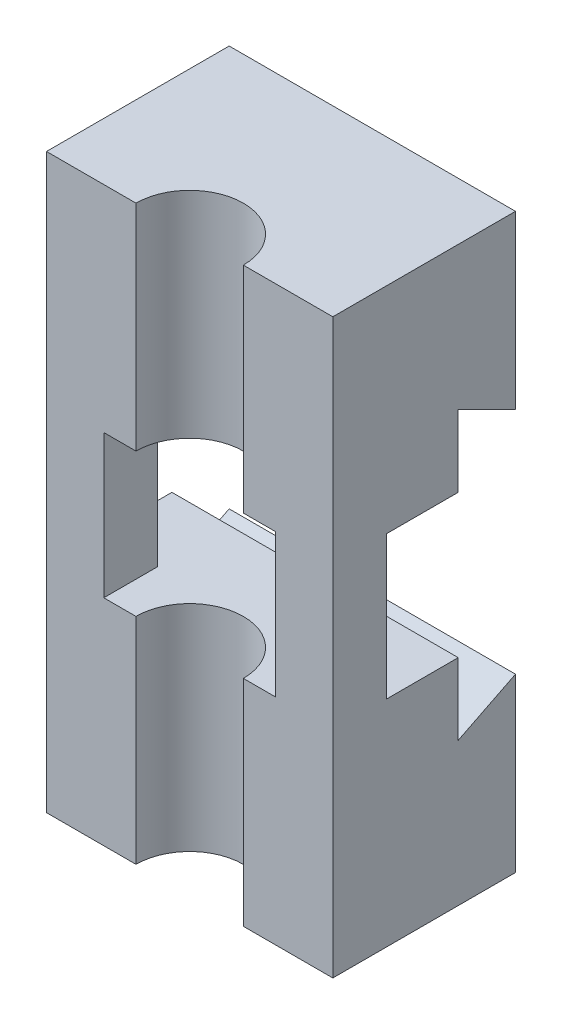
ISO-10303-21;
HEADER;
FILE_DESCRIPTION(('STEP AP214'),'2;1');
FILE_NAME('part.step','',(''),(''),'','','');
FILE_SCHEMA(('AUTOMOTIVE_DESIGN { 1 0 10303 214 1 1 1 1 }'));
ENDSEC;
DATA;
#1=APPLICATION_CONTEXT('core data for automotive mechanical design processes');
#2=APPLICATION_PROTOCOL_DEFINITION('international standard','automotive_design',2000,#1);
#3=PRODUCT_CONTEXT('',#1,'mechanical');
#4=PRODUCT('Part','Part','',(#3));
#5=PRODUCT_RELATED_PRODUCT_CATEGORY('part','',(#4));
#6=PRODUCT_DEFINITION_FORMATION('','',#4);
#7=PRODUCT_DEFINITION_CONTEXT('part definition',#1,'design');
#8=PRODUCT_DEFINITION('design','',#6,#7);
#9=PRODUCT_DEFINITION_SHAPE('','',#8);
#10=(LENGTH_UNIT() NAMED_UNIT(*) SI_UNIT(.MILLI.,.METRE.));
#11=(NAMED_UNIT(*) PLANE_ANGLE_UNIT() SI_UNIT($,.RADIAN.));
#12=(NAMED_UNIT(*) SI_UNIT($,.STERADIAN.) SOLID_ANGLE_UNIT());
#13=UNCERTAINTY_MEASURE_WITH_UNIT(LENGTH_MEASURE(1.E-05),#10,'distance_accuracy_value','');
#14=(GEOMETRIC_REPRESENTATION_CONTEXT(3) GLOBAL_UNCERTAINTY_ASSIGNED_CONTEXT((#13)) GLOBAL_UNIT_ASSIGNED_CONTEXT((#10,
#11,#12)) REPRESENTATION_CONTEXT('',''));
#15=CARTESIAN_POINT('',(0.,0.,0.));
#16=DIRECTION('',(0.,0.,1.));
#17=DIRECTION('',(1.,0.,0.));
#18=AXIS2_PLACEMENT_3D('',#15,#16,#17);
#19=CARTESIAN_POINT('',(10.,2.5,0.));
#20=DIRECTION('',(0.,1.,0.));
#21=DIRECTION('',(0.,0.,1.));
#22=AXIS2_PLACEMENT_3D('',#19,#20,#21);
#23=PLANE('',#22);
#24=DIRECTION('',(1.,0.,0.));
#25=VECTOR('',#24,1.);
#26=CARTESIAN_POINT('',(10.,2.5,-1.12));
#27=LINE('',#26,#25);
#28=CARTESIAN_POINT('',(2.,2.5,-1.12));
#29=VERTEX_POINT('',#28);
#30=CARTESIAN_POINT('',(3.125,2.5,-1.12));
#31=VERTEX_POINT('',#30);
#32=EDGE_CURVE('E60',#29,#31,#27,.T.);
#33=ORIENTED_EDGE('',*,*,#32,.F.);
#34=DIRECTION('',(0.,0.,-1.));
#35=VECTOR('',#34,1.);
#36=CARTESIAN_POINT('',(2.,2.5,1.88));
#37=LINE('',#36,#35);
#38=CARTESIAN_POINT('',(2.,2.5,-3.));
#39=VERTEX_POINT('',#38);
#40=EDGE_CURVE('E308',#29,#39,#37,.T.);
#41=ORIENTED_EDGE('',*,*,#40,.T.);
#42=DIRECTION('',(-1.,0.,0.));
#43=VECTOR('',#42,1.);
#44=CARTESIAN_POINT('',(10.,2.5,-3.));
#45=LINE('',#44,#43);
#46=CARTESIAN_POINT('',(0.,2.5,-3.));
#47=VERTEX_POINT('',#46);
#48=EDGE_CURVE('E261',#39,#47,#45,.T.);
#49=ORIENTED_EDGE('',*,*,#48,.T.);
#50=DIRECTION('',(0.,0.,-1.));
#51=VECTOR('',#50,1.);
#52=CARTESIAN_POINT('',(0.,2.5,0.));
#53=LINE('',#52,#51);
#54=CARTESIAN_POINT('',(0.,2.5,-5.5));
#55=VERTEX_POINT('',#54);
#56=EDGE_CURVE('E348',#47,#55,#53,.T.);
#57=ORIENTED_EDGE('',*,*,#56,.T.);
#58=DIRECTION('',(-1.,0.,0.));
#59=VECTOR('',#58,1.);
#60=CARTESIAN_POINT('',(10.,2.5,-5.5));
#61=LINE('',#60,#59);
#62=CARTESIAN_POINT('',(10.,2.5,-5.5));
#63=VERTEX_POINT('',#62);
#64=EDGE_CURVE('E257',#63,#55,#61,.T.);
#65=ORIENTED_EDGE('',*,*,#64,.F.);
#66=DIRECTION('',(0.,0.,-1.));
#67=VECTOR('',#66,1.);
#68=CARTESIAN_POINT('',(10.,2.5,0.));
#69=LINE('',#68,#67);
#70=CARTESIAN_POINT('',(10.,2.5,-3.));
#71=VERTEX_POINT('',#70);
#72=EDGE_CURVE('E316',#71,#63,#69,.T.);
#73=ORIENTED_EDGE('',*,*,#72,.F.);
#74=CARTESIAN_POINT('',(8.,2.5,-3.));
#75=VERTEX_POINT('',#74);
#76=EDGE_CURVE('E262',#71,#75,#45,.T.);
#77=ORIENTED_EDGE('',*,*,#76,.T.);
#78=DIRECTION('',(0.,0.,-1.));
#79=VECTOR('',#78,1.);
#80=CARTESIAN_POINT('',(8.,2.5,1.88));
#81=LINE('',#80,#79);
#82=CARTESIAN_POINT('',(8.,2.5,-1.12));
#83=VERTEX_POINT('',#82);
#84=EDGE_CURVE('E283',#83,#75,#81,.T.);
#85=ORIENTED_EDGE('',*,*,#84,.F.);
#86=CARTESIAN_POINT('',(6.875,2.5,-1.12));
#87=VERTEX_POINT('',#86);
#88=EDGE_CURVE('E274',#87,#83,#27,.T.);
#89=ORIENTED_EDGE('',*,*,#88,.F.);
#90=CARTESIAN_POINT('',(5.,2.5,-1.12));
#91=DIRECTION('',(0.,1.,0.));
#92=DIRECTION('',(0.,0.,1.));
#93=AXIS2_PLACEMENT_3D('',#90,#91,#92);
#94=CIRCLE('',#93,1.875);
#95=EDGE_CURVE('E269',#87,#31,#94,.T.);
#96=ORIENTED_EDGE('',*,*,#95,.T.);
#97=EDGE_LOOP('',(#33,#41,#49,#57,#65,#73,#77,#85,#89,#96));
#98=FACE_BOUND('',#97,.T.);
#99=ADVANCED_FACE('F45',(#98),#23,.F.);
#100=CARTESIAN_POINT('',(10.,9.99999999999999,0.));
#101=DIRECTION('',(0.,-1.,0.));
#102=DIRECTION('',(0.,0.,-1.));
#103=AXIS2_PLACEMENT_3D('',#100,#101,#102);
#104=PLANE('',#103);
#105=DIRECTION('',(-1.,0.,0.));
#106=VECTOR('',#105,1.);
#107=CARTESIAN_POINT('',(10.,9.99999999999999,-1.12));
#108=LINE('',#107,#106);
#109=CARTESIAN_POINT('',(10.,9.99999999999999,-1.12));
#110=VERTEX_POINT('',#109);
#111=CARTESIAN_POINT('',(6.875,9.99999999999999,-1.12));
#112=VERTEX_POINT('',#111);
#113=EDGE_CURVE('E68',#110,#112,#108,.T.);
#114=ORIENTED_EDGE('',*,*,#113,.F.);
#115=DIRECTION('',(0.,0.,1.));
#116=VECTOR('',#115,1.);
#117=CARTESIAN_POINT('',(10.,9.99999999999999,0.));
#118=LINE('',#117,#116);
#119=CARTESIAN_POINT('',(10.,9.99999999999999,-7.5));
#120=VERTEX_POINT('',#119);
#121=EDGE_CURVE('E330',#120,#110,#118,.T.);
#122=ORIENTED_EDGE('',*,*,#121,.F.);
#123=DIRECTION('',(-1.,0.,0.));
#124=VECTOR('',#123,1.);
#125=CARTESIAN_POINT('',(10.,9.99999999999999,-7.5));
#126=LINE('',#125,#124);
#127=CARTESIAN_POINT('',(0.,9.99999999999999,-7.5));
#128=VERTEX_POINT('',#127);
#129=EDGE_CURVE('E247',#120,#128,#126,.T.);
#130=ORIENTED_EDGE('',*,*,#129,.T.);
#131=DIRECTION('',(0.,0.,1.));
#132=VECTOR('',#131,1.);
#133=CARTESIAN_POINT('',(0.,9.99999999999999,0.));
#134=LINE('',#133,#132);
#135=CARTESIAN_POINT('',(0.,9.99999999999999,-1.12));
#136=VERTEX_POINT('',#135);
#137=EDGE_CURVE('E211',#128,#136,#134,.T.);
#138=ORIENTED_EDGE('',*,*,#137,.T.);
#139=CARTESIAN_POINT('',(3.125,9.99999999999999,-1.12));
#140=VERTEX_POINT('',#139);
#141=EDGE_CURVE('E186',#140,#136,#108,.T.);
#142=ORIENTED_EDGE('',*,*,#141,.F.);
#143=CARTESIAN_POINT('',(5.,9.99999999999999,-1.12));
#144=DIRECTION('',(0.,-1.,0.));
#145=DIRECTION('',(0.,0.,-1.));
#146=AXIS2_PLACEMENT_3D('',#143,#144,#145);
#147=CIRCLE('',#146,1.875);
#148=EDGE_CURVE('E270',#140,#112,#147,.T.);
#149=ORIENTED_EDGE('',*,*,#148,.T.);
#150=EDGE_LOOP('',(#114,#122,#130,#138,#142,#149));
#151=FACE_BOUND('',#150,.T.);
#152=ADVANCED_FACE('F367',(#151),#104,.F.);
#153=CARTESIAN_POINT('',(10.,-10.,0.));
#154=DIRECTION('',(0.,-1.,0.));
#155=DIRECTION('',(0.,0.,-1.));
#156=AXIS2_PLACEMENT_3D('',#153,#154,#155);
#157=PLANE('',#156);
#158=DIRECTION('',(0.,0.,1.));
#159=VECTOR('',#158,1.);
#160=CARTESIAN_POINT('',(10.,-10.,0.));
#161=LINE('',#160,#159);
#162=CARTESIAN_POINT('',(10.,-10.,-7.5));
#163=VERTEX_POINT('',#162);
#164=CARTESIAN_POINT('',(10.,-10.,-1.12));
#165=VERTEX_POINT('',#164);
#166=EDGE_CURVE('E335',#163,#165,#161,.T.);
#167=ORIENTED_EDGE('',*,*,#166,.T.);
#168=DIRECTION('',(1.,0.,0.));
#169=VECTOR('',#168,1.);
#170=CARTESIAN_POINT('',(10.,-10.,-1.12));
#171=LINE('',#170,#169);
#172=CARTESIAN_POINT('',(6.875,-10.,-1.12));
#173=VERTEX_POINT('',#172);
#174=EDGE_CURVE('E204',#173,#165,#171,.T.);
#175=ORIENTED_EDGE('',*,*,#174,.F.);
#176=CARTESIAN_POINT('',(5.,-10.,-1.12));
#177=DIRECTION('',(0.,-1.,0.));
#178=DIRECTION('',(0.,0.,-1.));
#179=AXIS2_PLACEMENT_3D('',#176,#177,#178);
#180=CIRCLE('',#179,1.875);
#181=CARTESIAN_POINT('',(3.125,-10.,-1.12));
#182=VERTEX_POINT('',#181);
#183=EDGE_CURVE('E202',#182,#173,#180,.T.);
#184=ORIENTED_EDGE('',*,*,#183,.F.);
#185=CARTESIAN_POINT('',(0.,-10.,-1.12));
#186=VERTEX_POINT('',#185);
#187=EDGE_CURVE('E183',#186,#182,#171,.T.);
#188=ORIENTED_EDGE('',*,*,#187,.F.);
#189=DIRECTION('',(0.,0.,1.));
#190=VECTOR('',#189,1.);
#191=CARTESIAN_POINT('',(0.,-10.,0.));
#192=LINE('',#191,#190);
#193=CARTESIAN_POINT('',(0.,-10.,-7.5));
#194=VERTEX_POINT('',#193);
#195=EDGE_CURVE('E199',#194,#186,#192,.T.);
#196=ORIENTED_EDGE('',*,*,#195,.F.);
#197=DIRECTION('',(-1.,0.,0.));
#198=VECTOR('',#197,1.);
#199=CARTESIAN_POINT('',(10.,-10.,-7.5));
#200=LINE('',#199,#198);
#201=EDGE_CURVE('E244',#163,#194,#200,.T.);
#202=ORIENTED_EDGE('',*,*,#201,.F.);
#203=EDGE_LOOP('',(#167,#175,#184,#188,#196,#202));
#204=FACE_BOUND('',#203,.T.);
#205=ADVANCED_FACE('F198',(#204),#157,.T.);
#206=CARTESIAN_POINT('',(10.,-2.5,0.));
#207=DIRECTION('',(0.,1.,0.));
#208=DIRECTION('',(0.,0.,1.));
#209=AXIS2_PLACEMENT_3D('',#206,#207,#208);
#210=PLANE('',#209);
#211=DIRECTION('',(0.,0.,-1.));
#212=VECTOR('',#211,1.);
#213=CARTESIAN_POINT('',(2.,-2.5,1.88));
#214=LINE('',#213,#212);
#215=CARTESIAN_POINT('',(2.,-2.5,-1.12));
#216=VERTEX_POINT('',#215);
#217=CARTESIAN_POINT('',(2.,-2.5,-3.));
#218=VERTEX_POINT('',#217);
#219=EDGE_CURVE('E301',#216,#218,#214,.T.);
#220=ORIENTED_EDGE('',*,*,#219,.F.);
#221=DIRECTION('',(1.,0.,0.));
#222=VECTOR('',#221,1.);
#223=CARTESIAN_POINT('',(10.,-2.5,-1.12));
#224=LINE('',#223,#222);
#225=CARTESIAN_POINT('',(3.125,-2.5,-1.12));
#226=VERTEX_POINT('',#225);
#227=EDGE_CURVE('E424',#216,#226,#224,.T.);
#228=ORIENTED_EDGE('',*,*,#227,.T.);
#229=CARTESIAN_POINT('',(5.,-2.5,-1.12));
#230=DIRECTION('',(0.,1.,0.));
#231=DIRECTION('',(0.,0.,1.));
#232=AXIS2_PLACEMENT_3D('',#229,#230,#231);
#233=CIRCLE('',#232,1.875);
#234=CARTESIAN_POINT('',(6.875,-2.5,-1.12));
#235=VERTEX_POINT('',#234);
#236=EDGE_CURVE('E266',#235,#226,#233,.T.);
#237=ORIENTED_EDGE('',*,*,#236,.F.);
#238=CARTESIAN_POINT('',(8.,-2.5,-1.12));
#239=VERTEX_POINT('',#238);
#240=EDGE_CURVE('E432',#235,#239,#224,.T.);
#241=ORIENTED_EDGE('',*,*,#240,.T.);
#242=DIRECTION('',(0.,0.,-1.));
#243=VECTOR('',#242,1.);
#244=CARTESIAN_POINT('',(8.,-2.5,1.88));
#245=LINE('',#244,#243);
#246=CARTESIAN_POINT('',(8.,-2.5,-3.));
#247=VERTEX_POINT('',#246);
#248=EDGE_CURVE('E302',#239,#247,#245,.T.);
#249=ORIENTED_EDGE('',*,*,#248,.T.);
#250=DIRECTION('',(-1.,0.,0.));
#251=VECTOR('',#250,1.);
#252=CARTESIAN_POINT('',(10.,-2.5,-3.));
#253=LINE('',#252,#251);
#254=CARTESIAN_POINT('',(10.,-2.5,-3.));
#255=VERTEX_POINT('',#254);
#256=EDGE_CURVE('E228',#255,#247,#253,.T.);
#257=ORIENTED_EDGE('',*,*,#256,.F.);
#258=DIRECTION('',(0.,0.,-1.));
#259=VECTOR('',#258,1.);
#260=CARTESIAN_POINT('',(10.,-2.5,0.));
#261=LINE('',#260,#259);
#262=CARTESIAN_POINT('',(10.,-2.5,-5.5));
#263=VERTEX_POINT('',#262);
#264=EDGE_CURVE('E341',#255,#263,#261,.T.);
#265=ORIENTED_EDGE('',*,*,#264,.T.);
#266=DIRECTION('',(-1.,0.,0.));
#267=VECTOR('',#266,1.);
#268=CARTESIAN_POINT('',(10.,-2.5,-5.5));
#269=LINE('',#268,#267);
#270=CARTESIAN_POINT('',(0.,-2.5,-5.5));
#271=VERTEX_POINT('',#270);
#272=EDGE_CURVE('E232',#263,#271,#269,.T.);
#273=ORIENTED_EDGE('',*,*,#272,.T.);
#274=DIRECTION('',(0.,0.,-1.));
#275=VECTOR('',#274,1.);
#276=CARTESIAN_POINT('',(0.,-2.5,0.));
#277=LINE('',#276,#275);
#278=CARTESIAN_POINT('',(0.,-2.5,-3.));
#279=VERTEX_POINT('',#278);
#280=EDGE_CURVE('E223',#279,#271,#277,.T.);
#281=ORIENTED_EDGE('',*,*,#280,.F.);
#282=EDGE_CURVE('E233',#218,#279,#253,.T.);
#283=ORIENTED_EDGE('',*,*,#282,.F.);
#284=EDGE_LOOP('',(#220,#228,#237,#241,#249,#257,#265,#273,#281,#283));
#285=FACE_BOUND('',#284,.T.);
#286=ADVANCED_FACE('F403',(#285),#210,.T.);
#287=CARTESIAN_POINT('',(10.,0.,0.));
#288=DIRECTION('',(1.,0.,0.));
#289=DIRECTION('',(0.,0.,-1.));
#290=AXIS2_PLACEMENT_3D('',#287,#288,#289);
#291=PLANE('',#290);
#292=ORIENTED_EDGE('',*,*,#121,.T.);
#293=DIRECTION('',(0.,1.,0.));
#294=VECTOR('',#293,1.);
#295=CARTESIAN_POINT('',(10.,-10.,-1.12));
#296=LINE('',#295,#294);
#297=EDGE_CURVE('E192',#165,#110,#296,.T.);
#298=ORIENTED_EDGE('',*,*,#297,.F.);
#299=ORIENTED_EDGE('',*,*,#166,.F.);
#300=DIRECTION('',(0.,1.,0.));
#301=VECTOR('',#300,1.);
#302=CARTESIAN_POINT('',(10.,0.,-7.5));
#303=LINE('',#302,#301);
#304=CARTESIAN_POINT('',(10.,-4.,-7.5));
#305=VERTEX_POINT('',#304);
#306=EDGE_CURVE('E331',#163,#305,#303,.T.);
#307=ORIENTED_EDGE('',*,*,#306,.T.);
#308=DIRECTION('',(0.,-0.447213595499957,0.894427190999916));
#309=VECTOR('',#308,1.);
#310=CARTESIAN_POINT('',(10.,-6.2,-3.09999999999999));
#311=LINE('',#310,#309);
#312=CARTESIAN_POINT('',(10.,-5.,-5.5));
#313=VERTEX_POINT('',#312);
#314=EDGE_CURVE('E338',#305,#313,#311,.T.);
#315=ORIENTED_EDGE('',*,*,#314,.T.);
#316=DIRECTION('',(0.,1.,0.));
#317=VECTOR('',#316,1.);
#318=CARTESIAN_POINT('',(10.,0.,-5.5));
#319=LINE('',#318,#317);
#320=EDGE_CURVE('E323',#313,#263,#319,.T.);
#321=ORIENTED_EDGE('',*,*,#320,.T.);
#322=ORIENTED_EDGE('',*,*,#264,.F.);
#323=DIRECTION('',(0.,1.,0.));
#324=VECTOR('',#323,1.);
#325=CARTESIAN_POINT('',(10.,0.,-3.));
#326=LINE('',#325,#324);
#327=EDGE_CURVE('E227',#255,#71,#326,.T.);
#328=ORIENTED_EDGE('',*,*,#327,.T.);
#329=ORIENTED_EDGE('',*,*,#72,.T.);
#330=CARTESIAN_POINT('',(10.,5.,-5.5));
#331=VERTEX_POINT('',#330);
#332=EDGE_CURVE('E319',#63,#331,#319,.T.);
#333=ORIENTED_EDGE('',*,*,#332,.T.);
#334=DIRECTION('',(0.,0.447213595499958,0.894427190999916));
#335=VECTOR('',#334,1.);
#336=CARTESIAN_POINT('',(10.,6.2,-3.1));
#337=LINE('',#336,#335);
#338=CARTESIAN_POINT('',(10.,4.,-7.5));
#339=VERTEX_POINT('',#338);
#340=EDGE_CURVE('E322',#339,#331,#337,.T.);
#341=ORIENTED_EDGE('',*,*,#340,.F.);
#342=EDGE_CURVE('E327',#339,#120,#303,.T.);
#343=ORIENTED_EDGE('',*,*,#342,.T.);
#344=EDGE_LOOP('',(#292,#298,#299,#307,#315,#321,#322,#328,#329,#333,#341,#343));
#345=FACE_BOUND('',#344,.T.);
#346=ADVANCED_FACE('F370',(#345),#291,.T.);
#347=CARTESIAN_POINT('',(0.,0.,0.));
#348=DIRECTION('',(1.,0.,0.));
#349=DIRECTION('',(0.,0.,-1.));
#350=AXIS2_PLACEMENT_3D('',#347,#348,#349);
#351=PLANE('',#350);
#352=DIRECTION('',(0.,1.,0.));
#353=VECTOR('',#352,1.);
#354=CARTESIAN_POINT('',(0.,-10.,-1.12));
#355=LINE('',#354,#353);
#356=EDGE_CURVE('E180',#186,#136,#355,.T.);
#357=ORIENTED_EDGE('',*,*,#356,.T.);
#358=ORIENTED_EDGE('',*,*,#137,.F.);
#359=DIRECTION('',(0.,1.,0.));
#360=VECTOR('',#359,1.);
#361=CARTESIAN_POINT('',(0.,0.,-7.5));
#362=LINE('',#361,#360);
#363=CARTESIAN_POINT('',(0.,4.,-7.5));
#364=VERTEX_POINT('',#363);
#365=EDGE_CURVE('E217',#364,#128,#362,.T.);
#366=ORIENTED_EDGE('',*,*,#365,.F.);
#367=DIRECTION('',(0.,0.447213595499958,0.894427190999916));
#368=VECTOR('',#367,1.);
#369=CARTESIAN_POINT('',(0.,6.2,-3.1));
#370=LINE('',#369,#368);
#371=CARTESIAN_POINT('',(0.,5.,-5.5));
#372=VERTEX_POINT('',#371);
#373=EDGE_CURVE('E355',#364,#372,#370,.T.);
#374=ORIENTED_EDGE('',*,*,#373,.T.);
#375=DIRECTION('',(0.,1.,0.));
#376=VECTOR('',#375,1.);
#377=CARTESIAN_POINT('',(0.,0.,-5.5));
#378=LINE('',#377,#376);
#379=EDGE_CURVE('E351',#55,#372,#378,.T.);
#380=ORIENTED_EDGE('',*,*,#379,.F.);
#381=ORIENTED_EDGE('',*,*,#56,.F.);
#382=DIRECTION('',(0.,1.,0.));
#383=VECTOR('',#382,1.);
#384=CARTESIAN_POINT('',(0.,0.,-3.));
#385=LINE('',#384,#383);
#386=EDGE_CURVE('E305',#279,#47,#385,.T.);
#387=ORIENTED_EDGE('',*,*,#386,.F.);
#388=ORIENTED_EDGE('',*,*,#280,.T.);
#389=CARTESIAN_POINT('',(0.,-5.,-5.5));
#390=VERTEX_POINT('',#389);
#391=EDGE_CURVE('E222',#390,#271,#378,.T.);
#392=ORIENTED_EDGE('',*,*,#391,.F.);
#393=DIRECTION('',(0.,-0.447213595499957,0.894427190999916));
#394=VECTOR('',#393,1.);
#395=CARTESIAN_POINT('',(0.,-6.2,-3.09999999999999));
#396=LINE('',#395,#394);
#397=CARTESIAN_POINT('',(0.,-4.,-7.5));
#398=VERTEX_POINT('',#397);
#399=EDGE_CURVE('E215',#398,#390,#396,.T.);
#400=ORIENTED_EDGE('',*,*,#399,.F.);
#401=EDGE_CURVE('E209',#194,#398,#362,.T.);
#402=ORIENTED_EDGE('',*,*,#401,.F.);
#403=ORIENTED_EDGE('',*,*,#195,.T.);
#404=EDGE_LOOP('',(#357,#358,#366,#374,#380,#381,#387,#388,#392,#400,#402,#403));
#405=FACE_BOUND('',#404,.T.);
#406=ADVANCED_FACE('F207',(#405),#351,.F.);
#407=CARTESIAN_POINT('',(8.,2.5,1.88));
#408=DIRECTION('',(1.,0.,0.));
#409=DIRECTION('',(0.,0.,-1.));
#410=AXIS2_PLACEMENT_3D('',#407,#408,#409);
#411=PLANE('',#410);
#412=DIRECTION('',(0.,-1.,0.));
#413=VECTOR('',#412,1.);
#414=CARTESIAN_POINT('',(8.,2.5,-1.12));
#415=LINE('',#414,#413);
#416=EDGE_CURVE('E285',#83,#239,#415,.T.);
#417=ORIENTED_EDGE('',*,*,#416,.F.);
#418=ORIENTED_EDGE('',*,*,#84,.T.);
#419=DIRECTION('',(0.,-1.,0.));
#420=VECTOR('',#419,1.);
#421=CARTESIAN_POINT('',(8.,2.5,-3.));
#422=LINE('',#421,#420);
#423=EDGE_CURVE('E293',#75,#247,#422,.T.);
#424=ORIENTED_EDGE('',*,*,#423,.T.);
#425=ORIENTED_EDGE('',*,*,#248,.F.);
#426=EDGE_LOOP('',(#417,#418,#424,#425));
#427=FACE_BOUND('',#426,.T.);
#428=ADVANCED_FACE('F475',(#427),#411,.F.);
#429=CARTESIAN_POINT('',(2.,-2.5,1.88));
#430=DIRECTION('',(-1.,0.,0.));
#431=DIRECTION('',(0.,0.,1.));
#432=AXIS2_PLACEMENT_3D('',#429,#430,#431);
#433=PLANE('',#432);
#434=DIRECTION('',(0.,1.,0.));
#435=VECTOR('',#434,1.);
#436=CARTESIAN_POINT('',(2.,-2.5,-1.12));
#437=LINE('',#436,#435);
#438=EDGE_CURVE('E427',#216,#29,#437,.T.);
#439=ORIENTED_EDGE('',*,*,#438,.F.);
#440=ORIENTED_EDGE('',*,*,#219,.T.);
#441=DIRECTION('',(0.,1.,0.));
#442=VECTOR('',#441,1.);
#443=CARTESIAN_POINT('',(2.,-2.5,-3.));
#444=LINE('',#443,#442);
#445=EDGE_CURVE('E289',#218,#39,#444,.T.);
#446=ORIENTED_EDGE('',*,*,#445,.T.);
#447=ORIENTED_EDGE('',*,*,#40,.F.);
#448=EDGE_LOOP('',(#439,#440,#446,#447));
#449=FACE_BOUND('',#448,.T.);
#450=ADVANCED_FACE('F447',(#449),#433,.F.);
#451=CARTESIAN_POINT('',(5.,9.99999999999999,-1.12));
#452=DIRECTION('',(0.,-1.,0.));
#453=DIRECTION('',(0.,0.,-1.));
#454=AXIS2_PLACEMENT_3D('',#451,#452,#453);
#455=CYLINDRICAL_SURFACE('',#454,1.875);
#456=DIRECTION('',(0.,-1.,0.));
#457=VECTOR('',#456,1.);
#458=CARTESIAN_POINT('',(3.125,9.99999999999999,-1.12));
#459=LINE('',#458,#457);
#460=EDGE_CURVE('E420',#182,#226,#459,.F.);
#461=ORIENTED_EDGE('',*,*,#460,.F.);
#462=ORIENTED_EDGE('',*,*,#183,.T.);
#463=DIRECTION('',(0.,-1.,0.));
#464=VECTOR('',#463,1.);
#465=CARTESIAN_POINT('',(6.875,9.99999999999999,-1.12));
#466=LINE('',#465,#464);
#467=EDGE_CURVE('E418',#235,#173,#466,.T.);
#468=ORIENTED_EDGE('',*,*,#467,.F.);
#469=ORIENTED_EDGE('',*,*,#236,.T.);
#470=EDGE_LOOP('',(#461,#462,#468,#469));
#471=FACE_BOUND('',#470,.T.);
#472=ADVANCED_FACE('F417',(#471),#455,.F.);
#473=DIRECTION('',(0.,-1.,0.));
#474=VECTOR('',#473,1.);
#475=CARTESIAN_POINT('',(3.125,9.99999999999999,-1.12));
#476=LINE('',#475,#474);
#477=EDGE_CURVE('E12',#31,#140,#476,.F.);
#478=ORIENTED_EDGE('',*,*,#477,.F.);
#479=ORIENTED_EDGE('',*,*,#95,.F.);
#480=DIRECTION('',(0.,-1.,0.));
#481=VECTOR('',#480,1.);
#482=CARTESIAN_POINT('',(6.875,9.99999999999999,-1.12));
#483=LINE('',#482,#481);
#484=EDGE_CURVE('E54',#112,#87,#483,.T.);
#485=ORIENTED_EDGE('',*,*,#484,.F.);
#486=ORIENTED_EDGE('',*,*,#148,.F.);
#487=EDGE_LOOP('',(#478,#479,#485,#486));
#488=FACE_BOUND('',#487,.T.);
#489=ADVANCED_FACE('F287',(#488),#455,.F.);
#490=CARTESIAN_POINT('',(10.,0.,-3.));
#491=DIRECTION('',(0.,0.,1.));
#492=DIRECTION('',(1.,0.,0.));
#493=AXIS2_PLACEMENT_3D('',#490,#491,#492);
#494=PLANE('',#493);
#495=ORIENTED_EDGE('',*,*,#256,.T.);
#496=ORIENTED_EDGE('',*,*,#423,.F.);
#497=ORIENTED_EDGE('',*,*,#76,.F.);
#498=ORIENTED_EDGE('',*,*,#327,.F.);
#499=EDGE_LOOP('',(#495,#496,#497,#498));
#500=FACE_BOUND('',#499,.T.);
#501=ADVANCED_FACE('F449',(#500),#494,.F.);
#502=ORIENTED_EDGE('',*,*,#48,.F.);
#503=ORIENTED_EDGE('',*,*,#445,.F.);
#504=ORIENTED_EDGE('',*,*,#282,.T.);
#505=ORIENTED_EDGE('',*,*,#386,.T.);
#506=EDGE_LOOP('',(#502,#503,#504,#505));
#507=FACE_BOUND('',#506,.T.);
#508=ADVANCED_FACE('F47',(#507),#494,.F.);
#509=CARTESIAN_POINT('',(10.,0.,-5.5));
#510=DIRECTION('',(0.,0.,1.));
#511=DIRECTION('',(1.,0.,0.));
#512=AXIS2_PLACEMENT_3D('',#509,#510,#511);
#513=PLANE('',#512);
#514=ORIENTED_EDGE('',*,*,#379,.T.);
#515=DIRECTION('',(-1.,0.,0.));
#516=VECTOR('',#515,1.);
#517=CARTESIAN_POINT('',(10.,5.,-5.5));
#518=LINE('',#517,#516);
#519=EDGE_CURVE('E254',#331,#372,#518,.T.);
#520=ORIENTED_EDGE('',*,*,#519,.F.);
#521=ORIENTED_EDGE('',*,*,#332,.F.);
#522=ORIENTED_EDGE('',*,*,#64,.T.);
#523=EDGE_LOOP('',(#514,#520,#521,#522));
#524=FACE_BOUND('',#523,.T.);
#525=ADVANCED_FACE('F381',(#524),#513,.F.);
#526=CARTESIAN_POINT('',(10.,6.2,-3.1));
#527=DIRECTION('',(0.,-0.894427190999916,0.447213595499958));
#528=DIRECTION('',(0.,-0.447213595499958,-0.894427190999916));
#529=AXIS2_PLACEMENT_3D('',#526,#527,#528);
#530=PLANE('',#529);
#531=ORIENTED_EDGE('',*,*,#373,.F.);
#532=DIRECTION('',(-1.,0.,0.));
#533=VECTOR('',#532,1.);
#534=CARTESIAN_POINT('',(10.,4.,-7.5));
#535=LINE('',#534,#533);
#536=EDGE_CURVE('E251',#339,#364,#535,.T.);
#537=ORIENTED_EDGE('',*,*,#536,.F.);
#538=ORIENTED_EDGE('',*,*,#340,.T.);
#539=ORIENTED_EDGE('',*,*,#519,.T.);
#540=EDGE_LOOP('',(#531,#537,#538,#539));
#541=FACE_BOUND('',#540,.T.);
#542=ADVANCED_FACE('F376',(#541),#530,.T.);
#543=CARTESIAN_POINT('',(10.,0.,-7.5));
#544=DIRECTION('',(0.,0.,1.));
#545=DIRECTION('',(1.,0.,0.));
#546=AXIS2_PLACEMENT_3D('',#543,#544,#545);
#547=PLANE('',#546);
#548=ORIENTED_EDGE('',*,*,#365,.T.);
#549=ORIENTED_EDGE('',*,*,#129,.F.);
#550=ORIENTED_EDGE('',*,*,#342,.F.);
#551=ORIENTED_EDGE('',*,*,#536,.T.);
#552=EDGE_LOOP('',(#548,#549,#550,#551));
#553=FACE_BOUND('',#552,.T.);
#554=ADVANCED_FACE('F362',(#553),#547,.F.);
#555=ORIENTED_EDGE('',*,*,#401,.T.);
#556=DIRECTION('',(-1.,0.,0.));
#557=VECTOR('',#556,1.);
#558=CARTESIAN_POINT('',(10.,-4.,-7.5));
#559=LINE('',#558,#557);
#560=EDGE_CURVE('E240',#305,#398,#559,.T.);
#561=ORIENTED_EDGE('',*,*,#560,.F.);
#562=ORIENTED_EDGE('',*,*,#306,.F.);
#563=ORIENTED_EDGE('',*,*,#201,.T.);
#564=EDGE_LOOP('',(#555,#561,#562,#563));
#565=FACE_BOUND('',#564,.T.);
#566=ADVANCED_FACE('F413',(#565),#547,.F.);
#567=CARTESIAN_POINT('',(10.,-6.2,-3.09999999999999));
#568=DIRECTION('',(0.,-0.894427190999916,-0.447213595499957));
#569=DIRECTION('',(0.,0.447213595499958,-0.894427190999916));
#570=AXIS2_PLACEMENT_3D('',#567,#568,#569);
#571=PLANE('',#570);
#572=ORIENTED_EDGE('',*,*,#399,.T.);
#573=DIRECTION('',(-1.,0.,0.));
#574=VECTOR('',#573,1.);
#575=CARTESIAN_POINT('',(10.,-5.,-5.5));
#576=LINE('',#575,#574);
#577=EDGE_CURVE('E236',#313,#390,#576,.T.);
#578=ORIENTED_EDGE('',*,*,#577,.F.);
#579=ORIENTED_EDGE('',*,*,#314,.F.);
#580=ORIENTED_EDGE('',*,*,#560,.T.);
#581=EDGE_LOOP('',(#572,#578,#579,#580));
#582=FACE_BOUND('',#581,.T.);
#583=ADVANCED_FACE('F411',(#582),#571,.F.);
#584=ORIENTED_EDGE('',*,*,#391,.T.);
#585=ORIENTED_EDGE('',*,*,#272,.F.);
#586=ORIENTED_EDGE('',*,*,#320,.F.);
#587=ORIENTED_EDGE('',*,*,#577,.T.);
#588=EDGE_LOOP('',(#584,#585,#586,#587));
#589=FACE_BOUND('',#588,.T.);
#590=ADVANCED_FACE('F396',(#589),#513,.F.);
#591=CARTESIAN_POINT('',(10.,-10.,-1.12));
#592=DIRECTION('',(0.,0.,1.));
#593=DIRECTION('',(1.,0.,0.));
#594=AXIS2_PLACEMENT_3D('',#591,#592,#593);
#595=PLANE('',#594);
#596=ORIENTED_EDGE('',*,*,#467,.T.);
#597=ORIENTED_EDGE('',*,*,#174,.T.);
#598=ORIENTED_EDGE('',*,*,#297,.T.);
#599=ORIENTED_EDGE('',*,*,#113,.T.);
#600=ORIENTED_EDGE('',*,*,#484,.T.);
#601=ORIENTED_EDGE('',*,*,#88,.T.);
#602=ORIENTED_EDGE('',*,*,#416,.T.);
#603=ORIENTED_EDGE('',*,*,#240,.F.);
#604=EDGE_LOOP('',(#596,#597,#598,#599,#600,#601,#602,#603));
#605=FACE_BOUND('',#604,.T.);
#606=ADVANCED_FACE('F273',(#605),#595,.T.);
#607=ORIENTED_EDGE('',*,*,#460,.T.);
#608=ORIENTED_EDGE('',*,*,#227,.F.);
#609=ORIENTED_EDGE('',*,*,#438,.T.);
#610=ORIENTED_EDGE('',*,*,#32,.T.);
#611=ORIENTED_EDGE('',*,*,#477,.T.);
#612=ORIENTED_EDGE('',*,*,#141,.T.);
#613=ORIENTED_EDGE('',*,*,#356,.F.);
#614=ORIENTED_EDGE('',*,*,#187,.T.);
#615=EDGE_LOOP('',(#607,#608,#609,#610,#611,#612,#613,#614));
#616=FACE_BOUND('',#615,.T.);
#617=ADVANCED_FACE('F182',(#616),#595,.T.);
#618=CLOSED_SHELL('',(#99,#152,#205,#286,#346,#406,#428,#450,#472,#489,#501,#508,#525,#542,#554,
#566,#583,#590,#606,#617));
#619=MANIFOLD_SOLID_BREP('B2',#618);
#620=ADVANCED_BREP_SHAPE_REPRESENTATION('',(#18,#619),#14);
#621=SHAPE_DEFINITION_REPRESENTATION(#9,#620);
ENDSEC;
END-ISO-10303-21;
